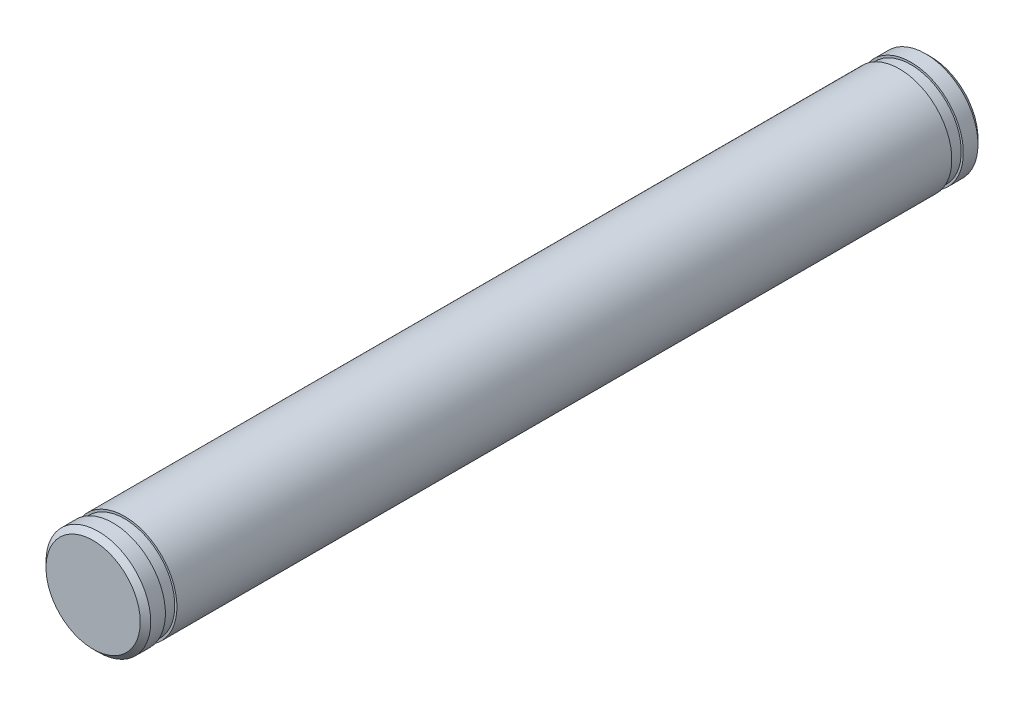
ISO-10303-21;
HEADER;
FILE_DESCRIPTION(('STEP AP214'),'2;1');
FILE_NAME('part.step','',(''),(''),'','','');
FILE_SCHEMA(('AUTOMOTIVE_DESIGN { 1 0 10303 214 1 1 1 1 }'));
ENDSEC;
DATA;
#1=APPLICATION_CONTEXT('core data for automotive mechanical design processes');
#2=APPLICATION_PROTOCOL_DEFINITION('international standard','automotive_design',2000,#1);
#3=PRODUCT_CONTEXT('',#1,'mechanical');
#4=PRODUCT('Part','Part','',(#3));
#5=PRODUCT_RELATED_PRODUCT_CATEGORY('part','',(#4));
#6=PRODUCT_DEFINITION_FORMATION('','',#4);
#7=PRODUCT_DEFINITION_CONTEXT('part definition',#1,'design');
#8=PRODUCT_DEFINITION('design','',#6,#7);
#9=PRODUCT_DEFINITION_SHAPE('','',#8);
#10=(LENGTH_UNIT() NAMED_UNIT(*) SI_UNIT(.MILLI.,.METRE.));
#11=(NAMED_UNIT(*) PLANE_ANGLE_UNIT() SI_UNIT($,.RADIAN.));
#12=(NAMED_UNIT(*) SI_UNIT($,.STERADIAN.) SOLID_ANGLE_UNIT());
#13=UNCERTAINTY_MEASURE_WITH_UNIT(LENGTH_MEASURE(1.E-05),#10,'distance_accuracy_value','');
#14=(GEOMETRIC_REPRESENTATION_CONTEXT(3) GLOBAL_UNCERTAINTY_ASSIGNED_CONTEXT((#13)) GLOBAL_UNIT_ASSIGNED_CONTEXT((#10,
#11,#12)) REPRESENTATION_CONTEXT('',''));
#15=CARTESIAN_POINT('',(0.,0.,0.));
#16=DIRECTION('',(0.,0.,1.));
#17=DIRECTION('',(1.,0.,0.));
#18=AXIS2_PLACEMENT_3D('',#15,#16,#17);
#19=CARTESIAN_POINT('',(0.,0.,80.));
#20=DIRECTION('',(0.,0.,-1.));
#21=DIRECTION('',(-1.,0.,0.));
#22=AXIS2_PLACEMENT_3D('',#19,#20,#21);
#23=CYLINDRICAL_SURFACE('',#22,5.);
#24=CARTESIAN_POINT('',(0.,0.,3.));
#25=DIRECTION('',(0.,0.,-1.));
#26=DIRECTION('',(-1.,0.,0.));
#27=AXIS2_PLACEMENT_3D('',#24,#25,#26);
#28=CIRCLE('',#27,5.);
#29=CARTESIAN_POINT('',(-5.,0.,3.));
#30=VERTEX_POINT('',#29);
#31=EDGE_CURVE('E57',#30,#30,#28,.T.);
#32=ORIENTED_EDGE('',*,*,#31,.F.);
#33=EDGE_LOOP('',(#32));
#34=FACE_BOUND('',#33,.T.);
#35=CARTESIAN_POINT('',(0.,0.,77.));
#36=DIRECTION('',(0.,0.,-1.));
#37=DIRECTION('',(-1.,0.,0.));
#38=AXIS2_PLACEMENT_3D('',#35,#36,#37);
#39=CIRCLE('',#38,5.);
#40=CARTESIAN_POINT('',(-5.,0.,77.));
#41=VERTEX_POINT('',#40);
#42=EDGE_CURVE('E69',#41,#41,#39,.T.);
#43=ORIENTED_EDGE('',*,*,#42,.T.);
#44=EDGE_LOOP('',(#43));
#45=FACE_BOUND('',#44,.T.);
#46=ADVANCED_FACE('F35',(#34,#45),#23,.T.);
#47=CARTESIAN_POINT('',(0.,0.,1.9));
#48=DIRECTION('',(0.,0.,-1.));
#49=DIRECTION('',(-1.,0.,0.));
#50=AXIS2_PLACEMENT_3D('',#47,#48,#49);
#51=CIRCLE('',#50,5.);
#52=CARTESIAN_POINT('',(-5.,0.,1.9));
#53=VERTEX_POINT('',#52);
#54=EDGE_CURVE('E56',#53,#53,#51,.T.);
#55=ORIENTED_EDGE('',*,*,#54,.T.);
#56=EDGE_LOOP('',(#55));
#57=FACE_BOUND('',#56,.T.);
#58=CARTESIAN_POINT('',(0.,0.,0.5));
#59=DIRECTION('',(0.,0.,1.));
#60=DIRECTION('',(1.,0.,0.));
#61=AXIS2_PLACEMENT_3D('',#58,#59,#60);
#62=CIRCLE('',#61,5.);
#63=CARTESIAN_POINT('',(5.,0.,0.5));
#64=VERTEX_POINT('',#63);
#65=EDGE_CURVE('E47',#64,#64,#62,.T.);
#66=ORIENTED_EDGE('',*,*,#65,.T.);
#67=EDGE_LOOP('',(#66));
#68=FACE_BOUND('',#67,.T.);
#69=ADVANCED_FACE('F96',(#57,#68),#23,.T.);
#70=CARTESIAN_POINT('',(0.,0.,0.));
#71=DIRECTION('',(0.,0.,1.));
#72=DIRECTION('',(1.,0.,0.));
#73=AXIS2_PLACEMENT_3D('',#70,#71,#72);
#74=PLANE('',#73);
#75=CARTESIAN_POINT('',(0.,0.,0.));
#76=DIRECTION('',(0.,0.,1.));
#77=DIRECTION('',(1.,0.,0.));
#78=AXIS2_PLACEMENT_3D('',#75,#76,#77);
#79=CIRCLE('',#78,4.5);
#80=CARTESIAN_POINT('',(4.5,0.,0.));
#81=VERTEX_POINT('',#80);
#82=EDGE_CURVE('E10',#81,#81,#79,.F.);
#83=ORIENTED_EDGE('',*,*,#82,.T.);
#84=EDGE_LOOP('',(#83));
#85=FACE_BOUND('',#84,.T.);
#86=ADVANCED_FACE('F104',(#85),#74,.F.);
#87=CARTESIAN_POINT('',(0.,0.,0.5));
#88=DIRECTION('',(0.,0.,1.));
#89=DIRECTION('',(1.,0.,0.));
#90=AXIS2_PLACEMENT_3D('',#87,#88,#89);
#91=CONICAL_SURFACE('',#90,5.,0.785398163397444);
#92=ORIENTED_EDGE('',*,*,#82,.F.);
#93=EDGE_LOOP('',(#92));
#94=FACE_BOUND('',#93,.T.);
#95=ORIENTED_EDGE('',*,*,#65,.F.);
#96=EDGE_LOOP('',(#95));
#97=FACE_BOUND('',#96,.T.);
#98=ADVANCED_FACE('F38',(#94,#97),#91,.T.);
#99=CARTESIAN_POINT('',(0.,0.,1.9));
#100=DIRECTION('',(0.,0.,-1.));
#101=DIRECTION('',(-1.,0.,0.));
#102=AXIS2_PLACEMENT_3D('',#99,#100,#101);
#103=PLANE('',#102);
#104=ORIENTED_EDGE('',*,*,#54,.F.);
#105=EDGE_LOOP('',(#104));
#106=FACE_BOUND('',#105,.T.);
#107=CARTESIAN_POINT('',(0.,0.,1.9));
#108=DIRECTION('',(0.,0.,-1.));
#109=DIRECTION('',(-1.,0.,0.));
#110=AXIS2_PLACEMENT_3D('',#107,#108,#109);
#111=CIRCLE('',#110,4.8);
#112=CARTESIAN_POINT('',(-4.8,0.,1.9));
#113=VERTEX_POINT('',#112);
#114=EDGE_CURVE('E60',#113,#113,#111,.T.);
#115=ORIENTED_EDGE('',*,*,#114,.T.);
#116=EDGE_LOOP('',(#115));
#117=FACE_BOUND('',#116,.T.);
#118=ADVANCED_FACE('F126',(#106,#117),#103,.F.);
#119=CARTESIAN_POINT('',(0.,0.,3.));
#120=DIRECTION('',(0.,0.,-1.));
#121=DIRECTION('',(-1.,0.,0.));
#122=AXIS2_PLACEMENT_3D('',#119,#120,#121);
#123=PLANE('',#122);
#124=ORIENTED_EDGE('',*,*,#31,.T.);
#125=EDGE_LOOP('',(#124));
#126=FACE_BOUND('',#125,.T.);
#127=CARTESIAN_POINT('',(0.,0.,3.));
#128=DIRECTION('',(0.,0.,-1.));
#129=DIRECTION('',(-1.,0.,0.));
#130=AXIS2_PLACEMENT_3D('',#127,#128,#129);
#131=CIRCLE('',#130,4.8);
#132=CARTESIAN_POINT('',(-4.8,0.,3.));
#133=VERTEX_POINT('',#132);
#134=EDGE_CURVE('E63',#133,#133,#131,.T.);
#135=ORIENTED_EDGE('',*,*,#134,.F.);
#136=EDGE_LOOP('',(#135));
#137=FACE_BOUND('',#136,.T.);
#138=ADVANCED_FACE('F124',(#126,#137),#123,.T.);
#139=CARTESIAN_POINT('',(0.,0.,1.9));
#140=DIRECTION('',(0.,0.,1.));
#141=DIRECTION('',(1.,0.,0.));
#142=AXIS2_PLACEMENT_3D('',#139,#140,#141);
#143=CYLINDRICAL_SURFACE('',#142,4.8);
#144=ORIENTED_EDGE('',*,*,#114,.F.);
#145=EDGE_LOOP('',(#144));
#146=FACE_BOUND('',#145,.T.);
#147=ORIENTED_EDGE('',*,*,#134,.T.);
#148=EDGE_LOOP('',(#147));
#149=FACE_BOUND('',#148,.T.);
#150=ADVANCED_FACE('F88',(#146,#149),#143,.T.);
#151=CARTESIAN_POINT('',(0.,0.,78.1));
#152=DIRECTION('',(0.,0.,1.));
#153=DIRECTION('',(-1.,0.,0.));
#154=AXIS2_PLACEMENT_3D('',#151,#152,#153);
#155=PLANE('',#154);
#156=CARTESIAN_POINT('',(0.,0.,78.1));
#157=DIRECTION('',(0.,0.,-1.));
#158=DIRECTION('',(-1.,0.,0.));
#159=AXIS2_PLACEMENT_3D('',#156,#157,#158);
#160=CIRCLE('',#159,4.8);
#161=CARTESIAN_POINT('',(-4.8,0.,78.1));
#162=VERTEX_POINT('',#161);
#163=EDGE_CURVE('E72',#162,#162,#160,.T.);
#164=ORIENTED_EDGE('',*,*,#163,.F.);
#165=EDGE_LOOP('',(#164));
#166=FACE_BOUND('',#165,.T.);
#167=CARTESIAN_POINT('',(0.,0.,78.1));
#168=DIRECTION('',(0.,0.,-1.));
#169=DIRECTION('',(-1.,0.,0.));
#170=AXIS2_PLACEMENT_3D('',#167,#168,#169);
#171=CIRCLE('',#170,5.);
#172=CARTESIAN_POINT('',(-5.,0.,78.1));
#173=VERTEX_POINT('',#172);
#174=EDGE_CURVE('E66',#173,#173,#171,.T.);
#175=ORIENTED_EDGE('',*,*,#174,.T.);
#176=EDGE_LOOP('',(#175));
#177=FACE_BOUND('',#176,.T.);
#178=ADVANCED_FACE('F84',(#166,#177),#155,.F.);
#179=CARTESIAN_POINT('',(0.,0.,77.));
#180=DIRECTION('',(0.,0.,1.));
#181=DIRECTION('',(-1.,0.,0.));
#182=AXIS2_PLACEMENT_3D('',#179,#180,#181);
#183=PLANE('',#182);
#184=CARTESIAN_POINT('',(0.,0.,77.));
#185=DIRECTION('',(0.,0.,-1.));
#186=DIRECTION('',(-1.,0.,0.));
#187=AXIS2_PLACEMENT_3D('',#184,#185,#186);
#188=CIRCLE('',#187,4.8);
#189=CARTESIAN_POINT('',(-4.8,0.,77.));
#190=VERTEX_POINT('',#189);
#191=EDGE_CURVE('E75',#190,#190,#188,.T.);
#192=ORIENTED_EDGE('',*,*,#191,.T.);
#193=EDGE_LOOP('',(#192));
#194=FACE_BOUND('',#193,.T.);
#195=ORIENTED_EDGE('',*,*,#42,.F.);
#196=EDGE_LOOP('',(#195));
#197=FACE_BOUND('',#196,.T.);
#198=ADVANCED_FACE('F87',(#194,#197),#183,.T.);
#199=CARTESIAN_POINT('',(0.,0.,78.1));
#200=DIRECTION('',(0.,0.,-1.));
#201=DIRECTION('',(-1.,0.,0.));
#202=AXIS2_PLACEMENT_3D('',#199,#200,#201);
#203=CYLINDRICAL_SURFACE('',#202,4.8);
#204=ORIENTED_EDGE('',*,*,#163,.T.);
#205=EDGE_LOOP('',(#204));
#206=FACE_BOUND('',#205,.T.);
#207=ORIENTED_EDGE('',*,*,#191,.F.);
#208=EDGE_LOOP('',(#207));
#209=FACE_BOUND('',#208,.T.);
#210=ADVANCED_FACE('F81',(#206,#209),#203,.T.);
#211=CARTESIAN_POINT('',(0.,0.,80.));
#212=DIRECTION('',(0.,0.,1.));
#213=DIRECTION('',(1.,0.,0.));
#214=AXIS2_PLACEMENT_3D('',#211,#212,#213);
#215=PLANE('',#214);
#216=CARTESIAN_POINT('',(0.,0.,80.));
#217=DIRECTION('',(0.,0.,1.));
#218=DIRECTION('',(1.,0.,0.));
#219=AXIS2_PLACEMENT_3D('',#216,#217,#218);
#220=CIRCLE('',#219,4.5);
#221=CARTESIAN_POINT('',(4.5,0.,80.));
#222=VERTEX_POINT('',#221);
#223=EDGE_CURVE('E51',#222,#222,#220,.T.);
#224=ORIENTED_EDGE('',*,*,#223,.T.);
#225=EDGE_LOOP('',(#224));
#226=FACE_BOUND('',#225,.T.);
#227=ADVANCED_FACE('F100',(#226),#215,.T.);
#228=CARTESIAN_POINT('',(0.,0.,80.));
#229=DIRECTION('',(0.,0.,-1.));
#230=DIRECTION('',(-1.,0.,0.));
#231=AXIS2_PLACEMENT_3D('',#228,#229,#230);
#232=CONICAL_SURFACE('',#231,4.5,0.785398163397451);
#233=CARTESIAN_POINT('',(0.,0.,79.5));
#234=DIRECTION('',(0.,0.,1.));
#235=DIRECTION('',(1.,0.,0.));
#236=AXIS2_PLACEMENT_3D('',#233,#234,#235);
#237=CIRCLE('',#236,5.);
#238=CARTESIAN_POINT('',(5.,0.,79.5));
#239=VERTEX_POINT('',#238);
#240=EDGE_CURVE('E43',#239,#239,#237,.F.);
#241=ORIENTED_EDGE('',*,*,#240,.F.);
#242=EDGE_LOOP('',(#241));
#243=FACE_BOUND('',#242,.T.);
#244=ORIENTED_EDGE('',*,*,#223,.F.);
#245=EDGE_LOOP('',(#244));
#246=FACE_BOUND('',#245,.T.);
#247=ADVANCED_FACE('F94',(#243,#246),#232,.T.);
#248=ORIENTED_EDGE('',*,*,#174,.F.);
#249=EDGE_LOOP('',(#248));
#250=FACE_BOUND('',#249,.T.);
#251=ORIENTED_EDGE('',*,*,#240,.T.);
#252=EDGE_LOOP('',(#251));
#253=FACE_BOUND('',#252,.T.);
#254=ADVANCED_FACE('F92',(#250,#253),#23,.T.);
#255=CLOSED_SHELL('',(#46,#69,#86,#98,#118,#138,#150,#178,#198,#210,#227,#247,#254));
#256=MANIFOLD_SOLID_BREP('B2',#255);
#257=ADVANCED_BREP_SHAPE_REPRESENTATION('',(#18,#256),#14);
#258=SHAPE_DEFINITION_REPRESENTATION(#9,#257);
ENDSEC;
END-ISO-10303-21;
